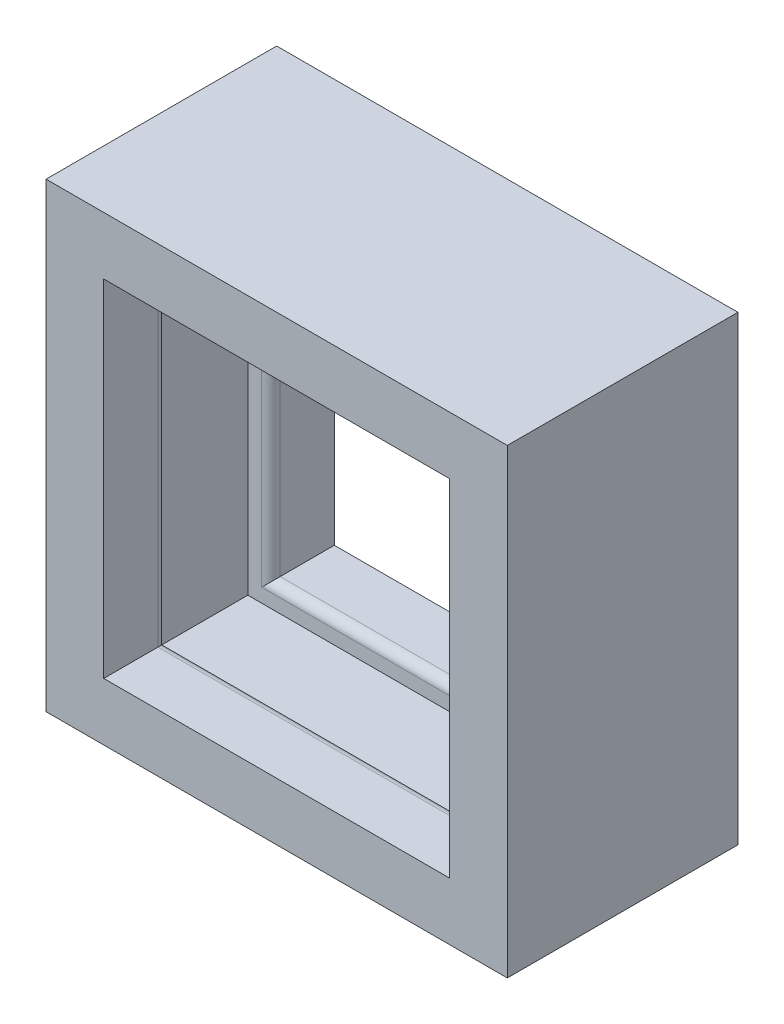
ISO-10303-21;
HEADER;
FILE_DESCRIPTION(('STEP AP214'),'2;1');
FILE_NAME('part.step','',(''),(''),'','','');
FILE_SCHEMA(('AUTOMOTIVE_DESIGN { 1 0 10303 214 1 1 1 1 }'));
ENDSEC;
DATA;
#1=APPLICATION_CONTEXT('core data for automotive mechanical design processes');
#2=APPLICATION_PROTOCOL_DEFINITION('international standard','automotive_design',2000,#1);
#3=PRODUCT_CONTEXT('',#1,'mechanical');
#4=PRODUCT('Part','Part','',(#3));
#5=PRODUCT_RELATED_PRODUCT_CATEGORY('part','',(#4));
#6=PRODUCT_DEFINITION_FORMATION('','',#4);
#7=PRODUCT_DEFINITION_CONTEXT('part definition',#1,'design');
#8=PRODUCT_DEFINITION('design','',#6,#7);
#9=PRODUCT_DEFINITION_SHAPE('','',#8);
#10=(LENGTH_UNIT() NAMED_UNIT(*) SI_UNIT(.MILLI.,.METRE.));
#11=(NAMED_UNIT(*) PLANE_ANGLE_UNIT() SI_UNIT($,.RADIAN.));
#12=(NAMED_UNIT(*) SI_UNIT($,.STERADIAN.) SOLID_ANGLE_UNIT());
#13=UNCERTAINTY_MEASURE_WITH_UNIT(LENGTH_MEASURE(1.E-05),#10,'distance_accuracy_value','');
#14=(GEOMETRIC_REPRESENTATION_CONTEXT(3) GLOBAL_UNCERTAINTY_ASSIGNED_CONTEXT((#13)) GLOBAL_UNIT_ASSIGNED_CONTEXT((#10,
#11,#12)) REPRESENTATION_CONTEXT('',''));
#15=CARTESIAN_POINT('',(0.,0.,0.));
#16=DIRECTION('',(0.,0.,1.));
#17=DIRECTION('',(1.,0.,0.));
#18=AXIS2_PLACEMENT_3D('',#15,#16,#17);
#19=CARTESIAN_POINT('',(75.,75.,50.));
#20=DIRECTION('',(-1.,0.,0.));
#21=DIRECTION('',(0.,0.,1.));
#22=AXIS2_PLACEMENT_3D('',#19,#20,#21);
#23=PLANE('',#22);
#24=DIRECTION('',(0.,0.,-1.));
#25=VECTOR('',#24,1.);
#26=CARTESIAN_POINT('',(75.,-75.,50.));
#27=LINE('',#26,#25);
#28=CARTESIAN_POINT('',(75.,-75.,-26.5));
#29=VERTEX_POINT('',#28);
#30=CARTESIAN_POINT('',(75.,-75.,-50.));
#31=VERTEX_POINT('',#30);
#32=EDGE_CURVE('E226',#29,#31,#27,.T.);
#33=ORIENTED_EDGE('',*,*,#32,.F.);
#34=DIRECTION('',(0.,1.,0.));
#35=VECTOR('',#34,1.);
#36=CARTESIAN_POINT('',(75.,75.,-26.5));
#37=LINE('',#36,#35);
#38=CARTESIAN_POINT('',(75.,75.,-26.5));
#39=VERTEX_POINT('',#38);
#40=EDGE_CURVE('E293',#29,#39,#37,.T.);
#41=ORIENTED_EDGE('',*,*,#40,.T.);
#42=DIRECTION('',(0.,0.,-1.));
#43=VECTOR('',#42,1.);
#44=CARTESIAN_POINT('',(75.,75.,50.));
#45=LINE('',#44,#43);
#46=CARTESIAN_POINT('',(75.,75.,-50.));
#47=VERTEX_POINT('',#46);
#48=EDGE_CURVE('E246',#39,#47,#45,.T.);
#49=ORIENTED_EDGE('',*,*,#48,.T.);
#50=DIRECTION('',(0.,1.,0.));
#51=VECTOR('',#50,1.);
#52=CARTESIAN_POINT('',(75.,75.,-50.));
#53=LINE('',#52,#51);
#54=EDGE_CURVE('E212',#31,#47,#53,.T.);
#55=ORIENTED_EDGE('',*,*,#54,.F.);
#56=EDGE_LOOP('',(#33,#41,#49,#55));
#57=FACE_BOUND('',#56,.T.);
#58=ADVANCED_FACE('F33',(#57),#23,.T.);
#59=CARTESIAN_POINT('',(-75.,75.,50.));
#60=DIRECTION('',(0.,-1.,0.));
#61=DIRECTION('',(0.,0.,-1.));
#62=AXIS2_PLACEMENT_3D('',#59,#60,#61);
#63=PLANE('',#62);
#64=ORIENTED_EDGE('',*,*,#48,.F.);
#65=DIRECTION('',(-1.,0.,0.));
#66=VECTOR('',#65,1.);
#67=CARTESIAN_POINT('',(-75.,75.,-26.5));
#68=LINE('',#67,#66);
#69=CARTESIAN_POINT('',(-75.,75.,-26.5));
#70=VERTEX_POINT('',#69);
#71=EDGE_CURVE('E279',#39,#70,#68,.T.);
#72=ORIENTED_EDGE('',*,*,#71,.T.);
#73=DIRECTION('',(0.,0.,-1.));
#74=VECTOR('',#73,1.);
#75=CARTESIAN_POINT('',(-75.,75.,50.));
#76=LINE('',#75,#74);
#77=CARTESIAN_POINT('',(-75.,75.,-50.));
#78=VERTEX_POINT('',#77);
#79=EDGE_CURVE('E242',#70,#78,#76,.T.);
#80=ORIENTED_EDGE('',*,*,#79,.T.);
#81=DIRECTION('',(-1.,0.,0.));
#82=VECTOR('',#81,1.);
#83=CARTESIAN_POINT('',(-75.,75.,-50.));
#84=LINE('',#83,#82);
#85=EDGE_CURVE('E229',#47,#78,#84,.T.);
#86=ORIENTED_EDGE('',*,*,#85,.F.);
#87=EDGE_LOOP('',(#64,#72,#80,#86));
#88=FACE_BOUND('',#87,.T.);
#89=ADVANCED_FACE('F372',(#88),#63,.T.);
#90=CARTESIAN_POINT('',(-75.,75.,50.));
#91=DIRECTION('',(1.,0.,0.));
#92=DIRECTION('',(0.,0.,-1.));
#93=AXIS2_PLACEMENT_3D('',#90,#91,#92);
#94=PLANE('',#93);
#95=ORIENTED_EDGE('',*,*,#79,.F.);
#96=DIRECTION('',(0.,-1.,0.));
#97=VECTOR('',#96,1.);
#98=CARTESIAN_POINT('',(-75.,75.,-26.5));
#99=LINE('',#98,#97);
#100=CARTESIAN_POINT('',(-75.,-75.,-26.5));
#101=VERTEX_POINT('',#100);
#102=EDGE_CURVE('E291',#70,#101,#99,.T.);
#103=ORIENTED_EDGE('',*,*,#102,.T.);
#104=DIRECTION('',(0.,0.,-1.));
#105=VECTOR('',#104,1.);
#106=CARTESIAN_POINT('',(-75.,-75.,50.));
#107=LINE('',#106,#105);
#108=CARTESIAN_POINT('',(-75.,-75.,-50.));
#109=VERTEX_POINT('',#108);
#110=EDGE_CURVE('E239',#101,#109,#107,.T.);
#111=ORIENTED_EDGE('',*,*,#110,.T.);
#112=DIRECTION('',(0.,-1.,0.));
#113=VECTOR('',#112,1.);
#114=CARTESIAN_POINT('',(-75.,75.,-50.));
#115=LINE('',#114,#113);
#116=EDGE_CURVE('E232',#78,#109,#115,.T.);
#117=ORIENTED_EDGE('',*,*,#116,.F.);
#118=EDGE_LOOP('',(#95,#103,#111,#117));
#119=FACE_BOUND('',#118,.T.);
#120=ADVANCED_FACE('F379',(#119),#94,.T.);
#121=CARTESIAN_POINT('',(-75.,-75.,50.));
#122=DIRECTION('',(0.,1.,0.));
#123=DIRECTION('',(0.,0.,1.));
#124=AXIS2_PLACEMENT_3D('',#121,#122,#123);
#125=PLANE('',#124);
#126=ORIENTED_EDGE('',*,*,#110,.F.);
#127=DIRECTION('',(1.,0.,0.));
#128=VECTOR('',#127,1.);
#129=CARTESIAN_POINT('',(-75.,-75.,-26.5));
#130=LINE('',#129,#128);
#131=EDGE_CURVE('E295',#101,#29,#130,.T.);
#132=ORIENTED_EDGE('',*,*,#131,.T.);
#133=ORIENTED_EDGE('',*,*,#32,.T.);
#134=DIRECTION('',(1.,0.,0.));
#135=VECTOR('',#134,1.);
#136=CARTESIAN_POINT('',(-75.,-75.,-50.));
#137=LINE('',#136,#135);
#138=EDGE_CURVE('E219',#109,#31,#137,.T.);
#139=ORIENTED_EDGE('',*,*,#138,.F.);
#140=EDGE_LOOP('',(#126,#132,#133,#139));
#141=FACE_BOUND('',#140,.T.);
#142=ADVANCED_FACE('F400',(#141),#125,.T.);
#143=CARTESIAN_POINT('',(0.,0.,50.));
#144=DIRECTION('',(0.,0.,-1.));
#145=DIRECTION('',(-1.,0.,0.));
#146=AXIS2_PLACEMENT_3D('',#143,#144,#145);
#147=PLANE('',#146);
#148=DIRECTION('',(0.,1.,0.));
#149=VECTOR('',#148,1.);
#150=CARTESIAN_POINT('',(100.,-100.,50.));
#151=LINE('',#150,#149);
#152=CARTESIAN_POINT('',(100.,-100.,50.));
#153=VERTEX_POINT('',#152);
#154=CARTESIAN_POINT('',(100.,100.,50.));
#155=VERTEX_POINT('',#154);
#156=EDGE_CURVE('E250',#153,#155,#151,.T.);
#157=ORIENTED_EDGE('',*,*,#156,.T.);
#158=DIRECTION('',(-1.,0.,0.));
#159=VECTOR('',#158,1.);
#160=CARTESIAN_POINT('',(-100.,100.,50.));
#161=LINE('',#160,#159);
#162=CARTESIAN_POINT('',(-100.,100.,50.));
#163=VERTEX_POINT('',#162);
#164=EDGE_CURVE('E253',#155,#163,#161,.T.);
#165=ORIENTED_EDGE('',*,*,#164,.T.);
#166=DIRECTION('',(0.,-1.,0.));
#167=VECTOR('',#166,1.);
#168=CARTESIAN_POINT('',(-100.,-100.,50.));
#169=LINE('',#168,#167);
#170=CARTESIAN_POINT('',(-100.,-100.,50.));
#171=VERTEX_POINT('',#170);
#172=EDGE_CURVE('E256',#163,#171,#169,.T.);
#173=ORIENTED_EDGE('',*,*,#172,.T.);
#174=DIRECTION('',(1.,0.,0.));
#175=VECTOR('',#174,1.);
#176=CARTESIAN_POINT('',(-100.,-100.,50.));
#177=LINE('',#176,#175);
#178=EDGE_CURVE('E258',#171,#153,#177,.T.);
#179=ORIENTED_EDGE('',*,*,#178,.T.);
#180=EDGE_LOOP('',(#157,#165,#173,#179));
#181=FACE_BOUND('',#180,.T.);
#182=DIRECTION('',(0.,1.,0.));
#183=VECTOR('',#182,1.);
#184=CARTESIAN_POINT('',(75.,75.,50.));
#185=LINE('',#184,#183);
#186=CARTESIAN_POINT('',(75.,-75.,50.));
#187=VERTEX_POINT('',#186);
#188=CARTESIAN_POINT('',(75.,75.,50.));
#189=VERTEX_POINT('',#188);
#190=EDGE_CURVE('E216',#187,#189,#185,.T.);
#191=ORIENTED_EDGE('',*,*,#190,.F.);
#192=DIRECTION('',(1.,0.,0.));
#193=VECTOR('',#192,1.);
#194=CARTESIAN_POINT('',(-75.,-75.,50.));
#195=LINE('',#194,#193);
#196=CARTESIAN_POINT('',(-75.,-75.,50.));
#197=VERTEX_POINT('',#196);
#198=EDGE_CURVE('E224',#197,#187,#195,.T.);
#199=ORIENTED_EDGE('',*,*,#198,.F.);
#200=DIRECTION('',(0.,-1.,0.));
#201=VECTOR('',#200,1.);
#202=CARTESIAN_POINT('',(-75.,75.,50.));
#203=LINE('',#202,#201);
#204=CARTESIAN_POINT('',(-75.,75.,50.));
#205=VERTEX_POINT('',#204);
#206=EDGE_CURVE('E221',#205,#197,#203,.T.);
#207=ORIENTED_EDGE('',*,*,#206,.F.);
#208=DIRECTION('',(-1.,0.,0.));
#209=VECTOR('',#208,1.);
#210=CARTESIAN_POINT('',(-75.,75.,50.));
#211=LINE('',#210,#209);
#212=EDGE_CURVE('E218',#189,#205,#211,.T.);
#213=ORIENTED_EDGE('',*,*,#212,.F.);
#214=EDGE_LOOP('',(#191,#199,#207,#213));
#215=FACE_BOUND('',#214,.T.);
#216=ADVANCED_FACE('F395',(#181,#215),#147,.F.);
#217=CARTESIAN_POINT('',(0.,0.,-50.));
#218=DIRECTION('',(0.,0.,-1.));
#219=DIRECTION('',(-1.,0.,0.));
#220=AXIS2_PLACEMENT_3D('',#217,#218,#219);
#221=PLANE('',#220);
#222=DIRECTION('',(0.,1.,0.));
#223=VECTOR('',#222,1.);
#224=CARTESIAN_POINT('',(100.,-100.,-50.));
#225=LINE('',#224,#223);
#226=CARTESIAN_POINT('',(100.,-100.,-50.));
#227=VERTEX_POINT('',#226);
#228=CARTESIAN_POINT('',(100.,100.,-50.));
#229=VERTEX_POINT('',#228);
#230=EDGE_CURVE('E249',#227,#229,#225,.T.);
#231=ORIENTED_EDGE('',*,*,#230,.F.);
#232=DIRECTION('',(1.,0.,0.));
#233=VECTOR('',#232,1.);
#234=CARTESIAN_POINT('',(-100.,-100.,-50.));
#235=LINE('',#234,#233);
#236=CARTESIAN_POINT('',(-100.,-100.,-50.));
#237=VERTEX_POINT('',#236);
#238=EDGE_CURVE('E254',#237,#227,#235,.T.);
#239=ORIENTED_EDGE('',*,*,#238,.F.);
#240=DIRECTION('',(0.,-1.,0.));
#241=VECTOR('',#240,1.);
#242=CARTESIAN_POINT('',(-100.,-100.,-50.));
#243=LINE('',#242,#241);
#244=CARTESIAN_POINT('',(-100.,100.,-50.));
#245=VERTEX_POINT('',#244);
#246=EDGE_CURVE('E265',#245,#237,#243,.T.);
#247=ORIENTED_EDGE('',*,*,#246,.F.);
#248=DIRECTION('',(-1.,0.,0.));
#249=VECTOR('',#248,1.);
#250=CARTESIAN_POINT('',(-100.,100.,-50.));
#251=LINE('',#250,#249);
#252=EDGE_CURVE('E263',#229,#245,#251,.T.);
#253=ORIENTED_EDGE('',*,*,#252,.F.);
#254=EDGE_LOOP('',(#231,#239,#247,#253));
#255=FACE_BOUND('',#254,.T.);
#256=ORIENTED_EDGE('',*,*,#138,.T.);
#257=ORIENTED_EDGE('',*,*,#54,.T.);
#258=ORIENTED_EDGE('',*,*,#85,.T.);
#259=ORIENTED_EDGE('',*,*,#116,.T.);
#260=EDGE_LOOP('',(#256,#257,#258,#259));
#261=FACE_BOUND('',#260,.T.);
#262=ADVANCED_FACE('F413',(#255,#261),#221,.T.);
#263=CARTESIAN_POINT('',(100.,-100.,50.));
#264=DIRECTION('',(-1.,0.,0.));
#265=DIRECTION('',(0.,0.,1.));
#266=AXIS2_PLACEMENT_3D('',#263,#264,#265);
#267=PLANE('',#266);
#268=ORIENTED_EDGE('',*,*,#230,.T.);
#269=DIRECTION('',(0.,0.,-1.));
#270=VECTOR('',#269,1.);
#271=CARTESIAN_POINT('',(100.,100.,50.));
#272=LINE('',#271,#270);
#273=EDGE_CURVE('E276',#155,#229,#272,.T.);
#274=ORIENTED_EDGE('',*,*,#273,.F.);
#275=ORIENTED_EDGE('',*,*,#156,.F.);
#276=DIRECTION('',(0.,0.,-1.));
#277=VECTOR('',#276,1.);
#278=CARTESIAN_POINT('',(100.,-100.,50.));
#279=LINE('',#278,#277);
#280=EDGE_CURVE('E260',#153,#227,#279,.T.);
#281=ORIENTED_EDGE('',*,*,#280,.T.);
#282=EDGE_LOOP('',(#268,#274,#275,#281));
#283=FACE_BOUND('',#282,.T.);
#284=ADVANCED_FACE('F445',(#283),#267,.F.);
#285=CARTESIAN_POINT('',(-100.,100.,50.));
#286=DIRECTION('',(0.,-1.,0.));
#287=DIRECTION('',(0.,0.,-1.));
#288=AXIS2_PLACEMENT_3D('',#285,#286,#287);
#289=PLANE('',#288);
#290=ORIENTED_EDGE('',*,*,#252,.T.);
#291=DIRECTION('',(0.,0.,-1.));
#292=VECTOR('',#291,1.);
#293=CARTESIAN_POINT('',(-100.,100.,50.));
#294=LINE('',#293,#292);
#295=EDGE_CURVE('E273',#163,#245,#294,.T.);
#296=ORIENTED_EDGE('',*,*,#295,.F.);
#297=ORIENTED_EDGE('',*,*,#164,.F.);
#298=ORIENTED_EDGE('',*,*,#273,.T.);
#299=EDGE_LOOP('',(#290,#296,#297,#298));
#300=FACE_BOUND('',#299,.T.);
#301=ADVANCED_FACE('F451',(#300),#289,.F.);
#302=CARTESIAN_POINT('',(-100.,-100.,50.));
#303=DIRECTION('',(1.,0.,0.));
#304=DIRECTION('',(0.,0.,-1.));
#305=AXIS2_PLACEMENT_3D('',#302,#303,#304);
#306=PLANE('',#305);
#307=ORIENTED_EDGE('',*,*,#246,.T.);
#308=DIRECTION('',(0.,0.,-1.));
#309=VECTOR('',#308,1.);
#310=CARTESIAN_POINT('',(-100.,-100.,50.));
#311=LINE('',#310,#309);
#312=EDGE_CURVE('E270',#171,#237,#311,.T.);
#313=ORIENTED_EDGE('',*,*,#312,.F.);
#314=ORIENTED_EDGE('',*,*,#172,.F.);
#315=ORIENTED_EDGE('',*,*,#295,.T.);
#316=EDGE_LOOP('',(#307,#313,#314,#315));
#317=FACE_BOUND('',#316,.T.);
#318=ADVANCED_FACE('F390',(#317),#306,.F.);
#319=CARTESIAN_POINT('',(-100.,-100.,50.));
#320=DIRECTION('',(0.,1.,0.));
#321=DIRECTION('',(0.,0.,1.));
#322=AXIS2_PLACEMENT_3D('',#319,#320,#321);
#323=PLANE('',#322);
#324=ORIENTED_EDGE('',*,*,#238,.T.);
#325=ORIENTED_EDGE('',*,*,#280,.F.);
#326=ORIENTED_EDGE('',*,*,#178,.F.);
#327=ORIENTED_EDGE('',*,*,#312,.T.);
#328=EDGE_LOOP('',(#324,#325,#326,#327));
#329=FACE_BOUND('',#328,.T.);
#330=ADVANCED_FACE('F385',(#329),#323,.F.);
#331=CARTESIAN_POINT('',(75.,75.,26.5));
#332=VERTEX_POINT('',#331);
#333=EDGE_CURVE('E247',#189,#332,#45,.T.);
#334=ORIENTED_EDGE('',*,*,#333,.T.);
#335=DIRECTION('',(0.,1.,0.));
#336=VECTOR('',#335,1.);
#337=CARTESIAN_POINT('',(75.,-75.,26.5));
#338=LINE('',#337,#336);
#339=CARTESIAN_POINT('',(75.,-75.,26.5));
#340=VERTEX_POINT('',#339);
#341=EDGE_CURVE('E56',#332,#340,#338,.F.);
#342=ORIENTED_EDGE('',*,*,#341,.T.);
#343=EDGE_CURVE('E237',#187,#340,#27,.T.);
#344=ORIENTED_EDGE('',*,*,#343,.F.);
#345=ORIENTED_EDGE('',*,*,#190,.T.);
#346=EDGE_LOOP('',(#334,#342,#344,#345));
#347=FACE_BOUND('',#346,.T.);
#348=ADVANCED_FACE('F375',(#347),#23,.T.);
#349=CARTESIAN_POINT('',(-75.,75.,26.5));
#350=VERTEX_POINT('',#349);
#351=EDGE_CURVE('E243',#205,#350,#76,.T.);
#352=ORIENTED_EDGE('',*,*,#351,.T.);
#353=DIRECTION('',(-1.,0.,0.));
#354=VECTOR('',#353,1.);
#355=CARTESIAN_POINT('',(75.,75.,26.5));
#356=LINE('',#355,#354);
#357=EDGE_CURVE('E315',#350,#332,#356,.F.);
#358=ORIENTED_EDGE('',*,*,#357,.T.);
#359=ORIENTED_EDGE('',*,*,#333,.F.);
#360=ORIENTED_EDGE('',*,*,#212,.T.);
#361=EDGE_LOOP('',(#352,#358,#359,#360));
#362=FACE_BOUND('',#361,.T.);
#363=ADVANCED_FACE('F345',(#362),#63,.T.);
#364=CARTESIAN_POINT('',(-75.,-75.,26.5));
#365=VERTEX_POINT('',#364);
#366=EDGE_CURVE('E240',#197,#365,#107,.T.);
#367=ORIENTED_EDGE('',*,*,#366,.T.);
#368=DIRECTION('',(0.,-1.,0.));
#369=VECTOR('',#368,1.);
#370=CARTESIAN_POINT('',(-75.,75.,26.5));
#371=LINE('',#370,#369);
#372=EDGE_CURVE('E42',#365,#350,#371,.F.);
#373=ORIENTED_EDGE('',*,*,#372,.T.);
#374=ORIENTED_EDGE('',*,*,#351,.F.);
#375=ORIENTED_EDGE('',*,*,#206,.T.);
#376=EDGE_LOOP('',(#367,#373,#374,#375));
#377=FACE_BOUND('',#376,.T.);
#378=ADVANCED_FACE('F341',(#377),#94,.T.);
#379=ORIENTED_EDGE('',*,*,#343,.T.);
#380=DIRECTION('',(1.,0.,0.));
#381=VECTOR('',#380,1.);
#382=CARTESIAN_POINT('',(-75.,-75.,26.5));
#383=LINE('',#382,#381);
#384=EDGE_CURVE('E11',#340,#365,#383,.F.);
#385=ORIENTED_EDGE('',*,*,#384,.T.);
#386=ORIENTED_EDGE('',*,*,#366,.F.);
#387=ORIENTED_EDGE('',*,*,#198,.T.);
#388=EDGE_LOOP('',(#379,#385,#386,#387));
#389=FACE_BOUND('',#388,.T.);
#390=ADVANCED_FACE('F397',(#389),#125,.T.);
#391=CARTESIAN_POINT('',(85.,85.,-22.5));
#392=DIRECTION('',(1.,0.,0.));
#393=DIRECTION('',(0.,0.,-1.));
#394=AXIS2_PLACEMENT_3D('',#391,#392,#393);
#395=PLANE('',#394);
#396=DIRECTION('',(0.,1.,0.));
#397=VECTOR('',#396,1.);
#398=CARTESIAN_POINT('',(85.,85.,22.5));
#399=LINE('',#398,#397);
#400=CARTESIAN_POINT('',(85.,-85.,22.5));
#401=VERTEX_POINT('',#400);
#402=CARTESIAN_POINT('',(85.,85.,22.5));
#403=VERTEX_POINT('',#402);
#404=EDGE_CURVE('E179',#401,#403,#399,.T.);
#405=ORIENTED_EDGE('',*,*,#404,.T.);
#406=DIRECTION('',(0.,0.,1.));
#407=VECTOR('',#406,1.);
#408=CARTESIAN_POINT('',(85.,85.,-22.5));
#409=LINE('',#408,#407);
#410=CARTESIAN_POINT('',(85.,85.,-22.5));
#411=VERTEX_POINT('',#410);
#412=EDGE_CURVE('E172',#411,#403,#409,.T.);
#413=ORIENTED_EDGE('',*,*,#412,.F.);
#414=DIRECTION('',(0.,1.,0.));
#415=VECTOR('',#414,1.);
#416=CARTESIAN_POINT('',(85.,85.,-22.5));
#417=LINE('',#416,#415);
#418=CARTESIAN_POINT('',(85.,-85.,-22.5));
#419=VERTEX_POINT('',#418);
#420=EDGE_CURVE('E176',#419,#411,#417,.T.);
#421=ORIENTED_EDGE('',*,*,#420,.F.);
#422=DIRECTION('',(0.,0.,1.));
#423=VECTOR('',#422,1.);
#424=CARTESIAN_POINT('',(85.,-85.,-22.5));
#425=LINE('',#424,#423);
#426=EDGE_CURVE('E210',#419,#401,#425,.T.);
#427=ORIENTED_EDGE('',*,*,#426,.T.);
#428=EDGE_LOOP('',(#405,#413,#421,#427));
#429=FACE_BOUND('',#428,.T.);
#430=ADVANCED_FACE('F174',(#429),#395,.F.);
#431=CARTESIAN_POINT('',(-85.,-85.,-22.5));
#432=DIRECTION('',(0.,-1.,0.));
#433=DIRECTION('',(0.,0.,-1.));
#434=AXIS2_PLACEMENT_3D('',#431,#432,#433);
#435=PLANE('',#434);
#436=DIRECTION('',(1.,0.,0.));
#437=VECTOR('',#436,1.);
#438=CARTESIAN_POINT('',(-85.,-85.,22.5));
#439=LINE('',#438,#437);
#440=CARTESIAN_POINT('',(-85.,-85.,22.5));
#441=VERTEX_POINT('',#440);
#442=EDGE_CURVE('E196',#441,#401,#439,.T.);
#443=ORIENTED_EDGE('',*,*,#442,.T.);
#444=ORIENTED_EDGE('',*,*,#426,.F.);
#445=DIRECTION('',(1.,0.,0.));
#446=VECTOR('',#445,1.);
#447=CARTESIAN_POINT('',(-85.,-85.,-22.5));
#448=LINE('',#447,#446);
#449=CARTESIAN_POINT('',(-85.,-85.,-22.5));
#450=VERTEX_POINT('',#449);
#451=EDGE_CURVE('E184',#450,#419,#448,.T.);
#452=ORIENTED_EDGE('',*,*,#451,.F.);
#453=DIRECTION('',(0.,0.,1.));
#454=VECTOR('',#453,1.);
#455=CARTESIAN_POINT('',(-85.,-85.,-22.5));
#456=LINE('',#455,#454);
#457=EDGE_CURVE('E213',#450,#441,#456,.T.);
#458=ORIENTED_EDGE('',*,*,#457,.T.);
#459=EDGE_LOOP('',(#443,#444,#452,#458));
#460=FACE_BOUND('',#459,.T.);
#461=ADVANCED_FACE('F360',(#460),#435,.F.);
#462=CARTESIAN_POINT('',(-85.,85.,-22.5));
#463=DIRECTION('',(-1.,0.,0.));
#464=DIRECTION('',(0.,0.,1.));
#465=AXIS2_PLACEMENT_3D('',#462,#463,#464);
#466=PLANE('',#465);
#467=DIRECTION('',(0.,-1.,0.));
#468=VECTOR('',#467,1.);
#469=CARTESIAN_POINT('',(-85.,85.,22.5));
#470=LINE('',#469,#468);
#471=CARTESIAN_POINT('',(-85.,85.,22.5));
#472=VERTEX_POINT('',#471);
#473=EDGE_CURVE('E199',#472,#441,#470,.T.);
#474=ORIENTED_EDGE('',*,*,#473,.T.);
#475=ORIENTED_EDGE('',*,*,#457,.F.);
#476=DIRECTION('',(0.,-1.,0.));
#477=VECTOR('',#476,1.);
#478=CARTESIAN_POINT('',(-85.,85.,-22.5));
#479=LINE('',#478,#477);
#480=CARTESIAN_POINT('',(-85.,85.,-22.5));
#481=VERTEX_POINT('',#480);
#482=EDGE_CURVE('E192',#481,#450,#479,.T.);
#483=ORIENTED_EDGE('',*,*,#482,.F.);
#484=DIRECTION('',(0.,0.,1.));
#485=VECTOR('',#484,1.);
#486=CARTESIAN_POINT('',(-85.,85.,-22.5));
#487=LINE('',#486,#485);
#488=EDGE_CURVE('E183',#481,#472,#487,.T.);
#489=ORIENTED_EDGE('',*,*,#488,.T.);
#490=EDGE_LOOP('',(#474,#475,#483,#489));
#491=FACE_BOUND('',#490,.T.);
#492=ADVANCED_FACE('F362',(#491),#466,.F.);
#493=CARTESIAN_POINT('',(-85.,85.,-22.5));
#494=DIRECTION('',(0.,1.,0.));
#495=DIRECTION('',(0.,0.,1.));
#496=AXIS2_PLACEMENT_3D('',#493,#494,#495);
#497=PLANE('',#496);
#498=DIRECTION('',(-1.,0.,0.));
#499=VECTOR('',#498,1.);
#500=CARTESIAN_POINT('',(-85.,85.,22.5));
#501=LINE('',#500,#499);
#502=EDGE_CURVE('E205',#403,#472,#501,.T.);
#503=ORIENTED_EDGE('',*,*,#502,.T.);
#504=ORIENTED_EDGE('',*,*,#488,.F.);
#505=DIRECTION('',(-1.,0.,0.));
#506=VECTOR('',#505,1.);
#507=CARTESIAN_POINT('',(-85.,85.,-22.5));
#508=LINE('',#507,#506);
#509=EDGE_CURVE('E187',#411,#481,#508,.T.);
#510=ORIENTED_EDGE('',*,*,#509,.F.);
#511=ORIENTED_EDGE('',*,*,#412,.T.);
#512=EDGE_LOOP('',(#503,#504,#510,#511));
#513=FACE_BOUND('',#512,.T.);
#514=ADVANCED_FACE('F188',(#513),#497,.F.);
#515=CARTESIAN_POINT('',(0.,0.,-22.5));
#516=DIRECTION('',(0.,0.,1.));
#517=DIRECTION('',(1.,0.,0.));
#518=AXIS2_PLACEMENT_3D('',#515,#516,#517);
#519=PLANE('',#518);
#520=DIRECTION('',(0.,-1.,0.));
#521=VECTOR('',#520,1.);
#522=CARTESIAN_POINT('',(-79.,0.,-22.5));
#523=LINE('',#522,#521);
#524=CARTESIAN_POINT('',(-79.,-79.,-22.5));
#525=VERTEX_POINT('',#524);
#526=CARTESIAN_POINT('',(-79.,79.,-22.5));
#527=VERTEX_POINT('',#526);
#528=EDGE_CURVE('E286',#525,#527,#523,.F.);
#529=ORIENTED_EDGE('',*,*,#528,.T.);
#530=DIRECTION('',(-1.,0.,0.));
#531=VECTOR('',#530,1.);
#532=CARTESIAN_POINT('',(0.,79.,-22.5));
#533=LINE('',#532,#531);
#534=CARTESIAN_POINT('',(79.,79.,-22.5));
#535=VERTEX_POINT('',#534);
#536=EDGE_CURVE('E288',#527,#535,#533,.F.);
#537=ORIENTED_EDGE('',*,*,#536,.T.);
#538=DIRECTION('',(0.,1.,0.));
#539=VECTOR('',#538,1.);
#540=CARTESIAN_POINT('',(79.,0.,-22.5));
#541=LINE('',#540,#539);
#542=CARTESIAN_POINT('',(79.,-79.,-22.5));
#543=VERTEX_POINT('',#542);
#544=EDGE_CURVE('E284',#535,#543,#541,.F.);
#545=ORIENTED_EDGE('',*,*,#544,.T.);
#546=DIRECTION('',(1.,0.,0.));
#547=VECTOR('',#546,1.);
#548=CARTESIAN_POINT('',(0.,-79.,-22.5));
#549=LINE('',#548,#547);
#550=EDGE_CURVE('E282',#543,#525,#549,.F.);
#551=ORIENTED_EDGE('',*,*,#550,.T.);
#552=EDGE_LOOP('',(#529,#537,#545,#551));
#553=FACE_BOUND('',#552,.T.);
#554=ORIENTED_EDGE('',*,*,#420,.T.);
#555=ORIENTED_EDGE('',*,*,#509,.T.);
#556=ORIENTED_EDGE('',*,*,#482,.T.);
#557=ORIENTED_EDGE('',*,*,#451,.T.);
#558=EDGE_LOOP('',(#554,#555,#556,#557));
#559=FACE_BOUND('',#558,.T.);
#560=ADVANCED_FACE('F194',(#553,#559),#519,.T.);
#561=CARTESIAN_POINT('',(0.,0.,22.5));
#562=DIRECTION('',(0.,0.,1.));
#563=DIRECTION('',(1.,0.,0.));
#564=AXIS2_PLACEMENT_3D('',#561,#562,#563);
#565=PLANE('',#564);
#566=DIRECTION('',(0.,1.,0.));
#567=VECTOR('',#566,1.);
#568=CARTESIAN_POINT('',(79.,75.,22.5));
#569=LINE('',#568,#567);
#570=CARTESIAN_POINT('',(79.,-79.,22.5));
#571=VERTEX_POINT('',#570);
#572=CARTESIAN_POINT('',(79.,79.,22.5));
#573=VERTEX_POINT('',#572);
#574=EDGE_CURVE('E310',#571,#573,#569,.T.);
#575=ORIENTED_EDGE('',*,*,#574,.T.);
#576=DIRECTION('',(-1.,0.,0.));
#577=VECTOR('',#576,1.);
#578=CARTESIAN_POINT('',(-75.,79.,22.5));
#579=LINE('',#578,#577);
#580=CARTESIAN_POINT('',(-79.,79.,22.5));
#581=VERTEX_POINT('',#580);
#582=EDGE_CURVE('E312',#573,#581,#579,.T.);
#583=ORIENTED_EDGE('',*,*,#582,.T.);
#584=DIRECTION('',(0.,-1.,0.));
#585=VECTOR('',#584,1.);
#586=CARTESIAN_POINT('',(-79.,-75.,22.5));
#587=LINE('',#586,#585);
#588=CARTESIAN_POINT('',(-79.,-79.,22.5));
#589=VERTEX_POINT('',#588);
#590=EDGE_CURVE('E308',#581,#589,#587,.T.);
#591=ORIENTED_EDGE('',*,*,#590,.T.);
#592=DIRECTION('',(1.,0.,0.));
#593=VECTOR('',#592,1.);
#594=CARTESIAN_POINT('',(75.,-79.,22.5));
#595=LINE('',#594,#593);
#596=EDGE_CURVE('E297',#589,#571,#595,.T.);
#597=ORIENTED_EDGE('',*,*,#596,.T.);
#598=EDGE_LOOP('',(#575,#583,#591,#597));
#599=FACE_BOUND('',#598,.T.);
#600=ORIENTED_EDGE('',*,*,#404,.F.);
#601=ORIENTED_EDGE('',*,*,#442,.F.);
#602=ORIENTED_EDGE('',*,*,#473,.F.);
#603=ORIENTED_EDGE('',*,*,#502,.F.);
#604=EDGE_LOOP('',(#600,#601,#602,#603));
#605=FACE_BOUND('',#604,.T.);
#606=ADVANCED_FACE('F352',(#599,#605),#565,.F.);
#607=CARTESIAN_POINT('',(-75.,-79.,-26.5));
#608=DIRECTION('',(1.,0.,0.));
#609=DIRECTION('',(0.,0.,-1.));
#610=AXIS2_PLACEMENT_3D('',#607,#608,#609);
#611=CYLINDRICAL_SURFACE('',#610,4.);
#612=CARTESIAN_POINT('',(-79.,-79.,-26.5));
#613=DIRECTION('',(0.707106781186547,-0.707106781186547,0.));
#614=DIRECTION('',(-0.707106781186547,-0.707106781186547,0.));
#615=AXIS2_PLACEMENT_3D('',#612,#613,#614);
#616=ELLIPSE('',#615,5.65685424949238,4.);
#617=EDGE_CURVE('E302',#525,#101,#616,.F.);
#618=ORIENTED_EDGE('',*,*,#617,.F.);
#619=ORIENTED_EDGE('',*,*,#550,.F.);
#620=CARTESIAN_POINT('',(79.,-79.,-26.5));
#621=DIRECTION('',(0.707106781186547,0.707106781186547,0.));
#622=DIRECTION('',(-0.707106781186547,0.707106781186547,0.));
#623=AXIS2_PLACEMENT_3D('',#620,#621,#622);
#624=ELLIPSE('',#623,5.65685424949238,4.);
#625=EDGE_CURVE('E206',#29,#543,#624,.T.);
#626=ORIENTED_EDGE('',*,*,#625,.F.);
#627=ORIENTED_EDGE('',*,*,#131,.F.);
#628=EDGE_LOOP('',(#618,#619,#626,#627));
#629=FACE_BOUND('',#628,.T.);
#630=ADVANCED_FACE('F355',(#629),#611,.T.);
#631=CARTESIAN_POINT('',(79.,75.,-26.5));
#632=DIRECTION('',(0.,1.,0.));
#633=DIRECTION('',(0.,0.,1.));
#634=AXIS2_PLACEMENT_3D('',#631,#632,#633);
#635=CYLINDRICAL_SURFACE('',#634,4.);
#636=ORIENTED_EDGE('',*,*,#625,.T.);
#637=ORIENTED_EDGE('',*,*,#544,.F.);
#638=CARTESIAN_POINT('',(79.,79.,-26.5));
#639=DIRECTION('',(-0.707106781186547,0.707106781186547,0.));
#640=DIRECTION('',(-0.707106781186547,-0.707106781186547,0.));
#641=AXIS2_PLACEMENT_3D('',#638,#639,#640);
#642=ELLIPSE('',#641,5.65685424949238,4.);
#643=EDGE_CURVE('E300',#39,#535,#642,.T.);
#644=ORIENTED_EDGE('',*,*,#643,.F.);
#645=ORIENTED_EDGE('',*,*,#40,.F.);
#646=EDGE_LOOP('',(#636,#637,#644,#645));
#647=FACE_BOUND('',#646,.T.);
#648=ADVANCED_FACE('F438',(#647),#635,.T.);
#649=CARTESIAN_POINT('',(-79.,75.,-26.5));
#650=DIRECTION('',(0.,-1.,0.));
#651=DIRECTION('',(0.,0.,-1.));
#652=AXIS2_PLACEMENT_3D('',#649,#650,#651);
#653=CYLINDRICAL_SURFACE('',#652,4.);
#654=ORIENTED_EDGE('',*,*,#617,.T.);
#655=ORIENTED_EDGE('',*,*,#102,.F.);
#656=CARTESIAN_POINT('',(-79.,79.,-26.5));
#657=DIRECTION('',(-0.707106781186547,-0.707106781186547,0.));
#658=DIRECTION('',(-0.707106781186547,0.707106781186547,0.));
#659=AXIS2_PLACEMENT_3D('',#656,#657,#658);
#660=ELLIPSE('',#659,5.65685424949238,4.);
#661=EDGE_CURVE('E298',#527,#70,#660,.F.);
#662=ORIENTED_EDGE('',*,*,#661,.F.);
#663=ORIENTED_EDGE('',*,*,#528,.F.);
#664=EDGE_LOOP('',(#654,#655,#662,#663));
#665=FACE_BOUND('',#664,.T.);
#666=ADVANCED_FACE('F428',(#665),#653,.T.);
#667=CARTESIAN_POINT('',(-75.,79.,-26.5));
#668=DIRECTION('',(-1.,0.,0.));
#669=DIRECTION('',(0.,0.,1.));
#670=AXIS2_PLACEMENT_3D('',#667,#668,#669);
#671=CYLINDRICAL_SURFACE('',#670,4.);
#672=ORIENTED_EDGE('',*,*,#643,.T.);
#673=ORIENTED_EDGE('',*,*,#536,.F.);
#674=ORIENTED_EDGE('',*,*,#661,.T.);
#675=ORIENTED_EDGE('',*,*,#71,.F.);
#676=EDGE_LOOP('',(#672,#673,#674,#675));
#677=FACE_BOUND('',#676,.T.);
#678=ADVANCED_FACE('F433',(#677),#671,.T.);
#679=CARTESIAN_POINT('',(0.,-79.,26.5));
#680=DIRECTION('',(-1.,0.,0.));
#681=DIRECTION('',(0.,0.,1.));
#682=AXIS2_PLACEMENT_3D('',#679,#680,#681);
#683=CYLINDRICAL_SURFACE('',#682,4.);
#684=CARTESIAN_POINT('',(-79.,-79.,26.5));
#685=DIRECTION('',(-0.707106781186547,0.707106781186547,0.));
#686=DIRECTION('',(0.707106781186547,0.707106781186547,0.));
#687=AXIS2_PLACEMENT_3D('',#684,#685,#686);
#688=ELLIPSE('',#687,5.65685424949238,4.);
#689=EDGE_CURVE('E323',#365,#589,#688,.T.);
#690=ORIENTED_EDGE('',*,*,#689,.F.);
#691=ORIENTED_EDGE('',*,*,#384,.F.);
#692=CARTESIAN_POINT('',(79.,-79.,26.5));
#693=DIRECTION('',(-0.707106781186547,-0.707106781186547,0.));
#694=DIRECTION('',(0.707106781186547,-0.707106781186547,0.));
#695=AXIS2_PLACEMENT_3D('',#692,#693,#694);
#696=ELLIPSE('',#695,5.65685424949238,4.);
#697=EDGE_CURVE('E37',#571,#340,#696,.F.);
#698=ORIENTED_EDGE('',*,*,#697,.F.);
#699=ORIENTED_EDGE('',*,*,#596,.F.);
#700=EDGE_LOOP('',(#690,#691,#698,#699));
#701=FACE_BOUND('',#700,.T.);
#702=ADVANCED_FACE('F35',(#701),#683,.T.);
#703=CARTESIAN_POINT('',(79.,0.,26.5));
#704=DIRECTION('',(0.,-1.,0.));
#705=DIRECTION('',(0.,0.,-1.));
#706=AXIS2_PLACEMENT_3D('',#703,#704,#705);
#707=CYLINDRICAL_SURFACE('',#706,4.);
#708=ORIENTED_EDGE('',*,*,#697,.T.);
#709=ORIENTED_EDGE('',*,*,#341,.F.);
#710=CARTESIAN_POINT('',(79.,79.,26.5));
#711=DIRECTION('',(0.707106781186547,-0.707106781186547,0.));
#712=DIRECTION('',(0.707106781186547,0.707106781186547,0.));
#713=AXIS2_PLACEMENT_3D('',#710,#711,#712);
#714=ELLIPSE('',#713,5.65685424949238,4.);
#715=EDGE_CURVE('E322',#573,#332,#714,.F.);
#716=ORIENTED_EDGE('',*,*,#715,.F.);
#717=ORIENTED_EDGE('',*,*,#574,.F.);
#718=EDGE_LOOP('',(#708,#709,#716,#717));
#719=FACE_BOUND('',#718,.T.);
#720=ADVANCED_FACE('F333',(#719),#707,.T.);
#721=CARTESIAN_POINT('',(-79.,0.,26.5));
#722=DIRECTION('',(0.,1.,0.));
#723=DIRECTION('',(0.,0.,1.));
#724=AXIS2_PLACEMENT_3D('',#721,#722,#723);
#725=CYLINDRICAL_SURFACE('',#724,4.);
#726=ORIENTED_EDGE('',*,*,#689,.T.);
#727=ORIENTED_EDGE('',*,*,#590,.F.);
#728=CARTESIAN_POINT('',(-79.,79.,26.5));
#729=DIRECTION('',(0.707106781186547,0.707106781186547,0.));
#730=DIRECTION('',(0.707106781186547,-0.707106781186547,0.));
#731=AXIS2_PLACEMENT_3D('',#728,#729,#730);
#732=ELLIPSE('',#731,5.65685424949238,4.);
#733=EDGE_CURVE('E320',#350,#581,#732,.T.);
#734=ORIENTED_EDGE('',*,*,#733,.F.);
#735=ORIENTED_EDGE('',*,*,#372,.F.);
#736=EDGE_LOOP('',(#726,#727,#734,#735));
#737=FACE_BOUND('',#736,.T.);
#738=ADVANCED_FACE('F338',(#737),#725,.T.);
#739=CARTESIAN_POINT('',(0.,79.,26.5));
#740=DIRECTION('',(1.,0.,0.));
#741=DIRECTION('',(0.,0.,-1.));
#742=AXIS2_PLACEMENT_3D('',#739,#740,#741);
#743=CYLINDRICAL_SURFACE('',#742,4.);
#744=ORIENTED_EDGE('',*,*,#715,.T.);
#745=ORIENTED_EDGE('',*,*,#357,.F.);
#746=ORIENTED_EDGE('',*,*,#733,.T.);
#747=ORIENTED_EDGE('',*,*,#582,.F.);
#748=EDGE_LOOP('',(#744,#745,#746,#747));
#749=FACE_BOUND('',#748,.T.);
#750=ADVANCED_FACE('F349',(#749),#743,.T.);
#751=CLOSED_SHELL('',(#58,#89,#120,#142,#216,#262,#284,#301,#318,#330,#348,#363,#378,#390,#430,
#461,#492,#514,#560,#606,#630,#648,#666,#678,#702,#720,#738,#750));
#752=MANIFOLD_SOLID_BREP('B2',#751);
#753=ADVANCED_BREP_SHAPE_REPRESENTATION('',(#18,#752),#14);
#754=SHAPE_DEFINITION_REPRESENTATION(#9,#753);
ENDSEC;
END-ISO-10303-21;
